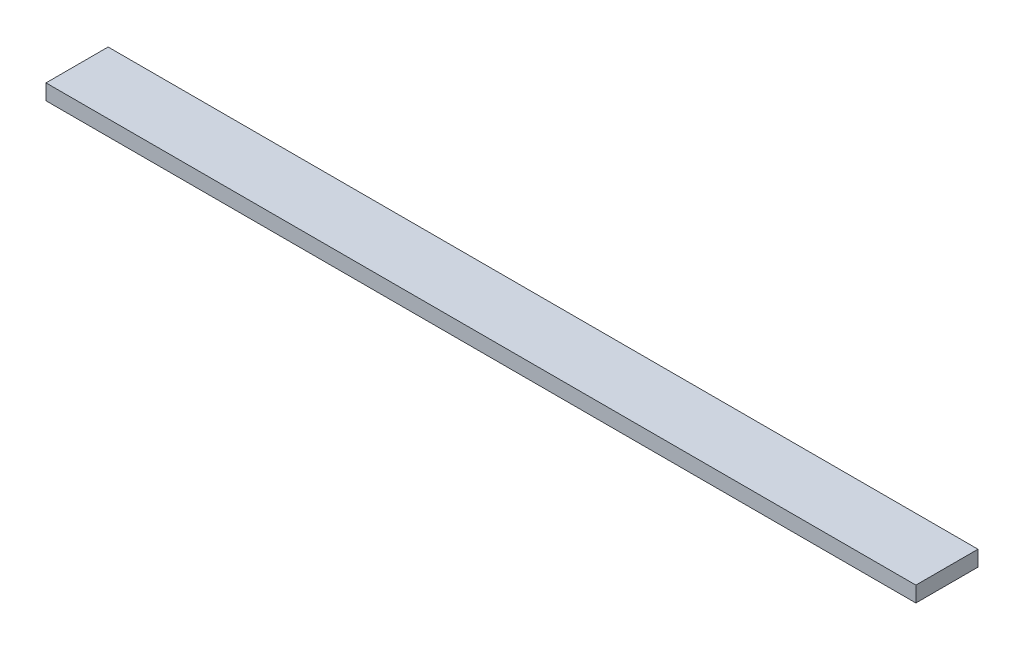
ISO-10303-21;
HEADER;
FILE_DESCRIPTION(('STEP AP214'),'2;1');
FILE_NAME('part.step','',(''),(''),'','','');
FILE_SCHEMA(('AUTOMOTIVE_DESIGN { 1 0 10303 214 1 1 1 1 }'));
ENDSEC;
DATA;
#1=APPLICATION_CONTEXT('core data for automotive mechanical design processes');
#2=APPLICATION_PROTOCOL_DEFINITION('international standard','automotive_design',2000,#1);
#3=PRODUCT_CONTEXT('',#1,'mechanical');
#4=PRODUCT('Part','Part','',(#3));
#5=PRODUCT_RELATED_PRODUCT_CATEGORY('part','',(#4));
#6=PRODUCT_DEFINITION_FORMATION('','',#4);
#7=PRODUCT_DEFINITION_CONTEXT('part definition',#1,'design');
#8=PRODUCT_DEFINITION('design','',#6,#7);
#9=PRODUCT_DEFINITION_SHAPE('','',#8);
#10=(LENGTH_UNIT() NAMED_UNIT(*) SI_UNIT(.MILLI.,.METRE.));
#11=(NAMED_UNIT(*) PLANE_ANGLE_UNIT() SI_UNIT($,.RADIAN.));
#12=(NAMED_UNIT(*) SI_UNIT($,.STERADIAN.) SOLID_ANGLE_UNIT());
#13=UNCERTAINTY_MEASURE_WITH_UNIT(LENGTH_MEASURE(1.E-05),#10,'distance_accuracy_value','');
#14=(GEOMETRIC_REPRESENTATION_CONTEXT(3) GLOBAL_UNCERTAINTY_ASSIGNED_CONTEXT((#13)) GLOBAL_UNIT_ASSIGNED_CONTEXT((#10,
#11,#12)) REPRESENTATION_CONTEXT('',''));
#15=CARTESIAN_POINT('',(0.,0.,0.));
#16=DIRECTION('',(0.,0.,1.));
#17=DIRECTION('',(1.,0.,0.));
#18=AXIS2_PLACEMENT_3D('',#15,#16,#17);
#19=CARTESIAN_POINT('',(0.,3.175,0.));
#20=DIRECTION('',(1.,0.,0.));
#21=DIRECTION('',(0.,0.,-1.));
#22=AXIS2_PLACEMENT_3D('',#19,#20,#21);
#23=PLANE('',#22);
#24=DIRECTION('',(0.,0.,1.));
#25=VECTOR('',#24,1.);
#26=CARTESIAN_POINT('',(0.,0.,0.));
#27=LINE('',#26,#25);
#28=CARTESIAN_POINT('',(0.,0.,-12.7));
#29=VERTEX_POINT('',#28);
#30=CARTESIAN_POINT('',(0.,0.,0.));
#31=VERTEX_POINT('',#30);
#32=EDGE_CURVE('E95',#29,#31,#27,.T.);
#33=ORIENTED_EDGE('',*,*,#32,.T.);
#34=DIRECTION('',(0.,-1.,0.));
#35=VECTOR('',#34,1.);
#36=CARTESIAN_POINT('',(0.,3.175,0.));
#37=LINE('',#36,#35);
#38=CARTESIAN_POINT('',(0.,3.175,0.));
#39=VERTEX_POINT('',#38);
#40=EDGE_CURVE('E11',#39,#31,#37,.T.);
#41=ORIENTED_EDGE('',*,*,#40,.F.);
#42=DIRECTION('',(0.,0.,1.));
#43=VECTOR('',#42,1.);
#44=CARTESIAN_POINT('',(0.,3.175,0.));
#45=LINE('',#44,#43);
#46=CARTESIAN_POINT('',(0.,3.175,-12.7));
#47=VERTEX_POINT('',#46);
#48=EDGE_CURVE('E83',#47,#39,#45,.T.);
#49=ORIENTED_EDGE('',*,*,#48,.F.);
#50=DIRECTION('',(0.,-1.,0.));
#51=VECTOR('',#50,1.);
#52=CARTESIAN_POINT('',(0.,3.175,-12.7));
#53=LINE('',#52,#51);
#54=EDGE_CURVE('E91',#47,#29,#53,.T.);
#55=ORIENTED_EDGE('',*,*,#54,.T.);
#56=EDGE_LOOP('',(#33,#41,#49,#55));
#57=FACE_BOUND('',#56,.T.);
#58=ADVANCED_FACE('F32',(#57),#23,.F.);
#59=CARTESIAN_POINT('',(0.,3.175,0.));
#60=DIRECTION('',(0.,0.,-1.));
#61=DIRECTION('',(-1.,0.,0.));
#62=AXIS2_PLACEMENT_3D('',#59,#60,#61);
#63=PLANE('',#62);
#64=DIRECTION('',(1.,0.,0.));
#65=VECTOR('',#64,1.);
#66=CARTESIAN_POINT('',(0.,0.,0.));
#67=LINE('',#66,#65);
#68=CARTESIAN_POINT('',(177.8,0.,0.));
#69=VERTEX_POINT('',#68);
#70=EDGE_CURVE('E87',#31,#69,#67,.T.);
#71=ORIENTED_EDGE('',*,*,#70,.T.);
#72=DIRECTION('',(0.,-1.,0.));
#73=VECTOR('',#72,1.);
#74=CARTESIAN_POINT('',(177.8,3.175,0.));
#75=LINE('',#74,#73);
#76=CARTESIAN_POINT('',(177.8,3.175,0.));
#77=VERTEX_POINT('',#76);
#78=EDGE_CURVE('E40',#77,#69,#75,.T.);
#79=ORIENTED_EDGE('',*,*,#78,.F.);
#80=DIRECTION('',(1.,0.,0.));
#81=VECTOR('',#80,1.);
#82=CARTESIAN_POINT('',(0.,3.175,0.));
#83=LINE('',#82,#81);
#84=EDGE_CURVE('E78',#39,#77,#83,.T.);
#85=ORIENTED_EDGE('',*,*,#84,.F.);
#86=ORIENTED_EDGE('',*,*,#40,.T.);
#87=EDGE_LOOP('',(#71,#79,#85,#86));
#88=FACE_BOUND('',#87,.T.);
#89=ADVANCED_FACE('F86',(#88),#63,.F.);
#90=CARTESIAN_POINT('',(177.8,3.175,0.));
#91=DIRECTION('',(-1.,0.,0.));
#92=DIRECTION('',(0.,0.,1.));
#93=AXIS2_PLACEMENT_3D('',#90,#91,#92);
#94=PLANE('',#93);
#95=DIRECTION('',(0.,0.,-1.));
#96=VECTOR('',#95,1.);
#97=CARTESIAN_POINT('',(177.8,0.,0.));
#98=LINE('',#97,#96);
#99=CARTESIAN_POINT('',(177.8,0.,-12.7));
#100=VERTEX_POINT('',#99);
#101=EDGE_CURVE('E65',#69,#100,#98,.T.);
#102=ORIENTED_EDGE('',*,*,#101,.T.);
#103=DIRECTION('',(0.,-1.,0.));
#104=VECTOR('',#103,1.);
#105=CARTESIAN_POINT('',(177.8,3.175,-12.7));
#106=LINE('',#105,#104);
#107=CARTESIAN_POINT('',(177.8,3.175,-12.7));
#108=VERTEX_POINT('',#107);
#109=EDGE_CURVE('E88',#108,#100,#106,.T.);
#110=ORIENTED_EDGE('',*,*,#109,.F.);
#111=DIRECTION('',(0.,0.,-1.));
#112=VECTOR('',#111,1.);
#113=CARTESIAN_POINT('',(177.8,3.175,0.));
#114=LINE('',#113,#112);
#115=EDGE_CURVE('E81',#77,#108,#114,.T.);
#116=ORIENTED_EDGE('',*,*,#115,.F.);
#117=ORIENTED_EDGE('',*,*,#78,.T.);
#118=EDGE_LOOP('',(#102,#110,#116,#117));
#119=FACE_BOUND('',#118,.T.);
#120=ADVANCED_FACE('F89',(#119),#94,.F.);
#121=CARTESIAN_POINT('',(0.,3.175,-12.7));
#122=DIRECTION('',(0.,0.,1.));
#123=DIRECTION('',(1.,0.,0.));
#124=AXIS2_PLACEMENT_3D('',#121,#122,#123);
#125=PLANE('',#124);
#126=DIRECTION('',(-1.,0.,0.));
#127=VECTOR('',#126,1.);
#128=CARTESIAN_POINT('',(0.,0.,-12.7));
#129=LINE('',#128,#127);
#130=EDGE_CURVE('E71',#100,#29,#129,.T.);
#131=ORIENTED_EDGE('',*,*,#130,.T.);
#132=ORIENTED_EDGE('',*,*,#54,.F.);
#133=DIRECTION('',(-1.,0.,0.));
#134=VECTOR('',#133,1.);
#135=CARTESIAN_POINT('',(0.,3.175,-12.7));
#136=LINE('',#135,#134);
#137=EDGE_CURVE('E48',#108,#47,#136,.T.);
#138=ORIENTED_EDGE('',*,*,#137,.F.);
#139=ORIENTED_EDGE('',*,*,#109,.T.);
#140=EDGE_LOOP('',(#131,#132,#138,#139));
#141=FACE_BOUND('',#140,.T.);
#142=ADVANCED_FACE('F102',(#141),#125,.F.);
#143=CARTESIAN_POINT('',(0.,3.175,0.));
#144=DIRECTION('',(0.,-1.,0.));
#145=DIRECTION('',(0.,0.,-1.));
#146=AXIS2_PLACEMENT_3D('',#143,#144,#145);
#147=PLANE('',#146);
#148=ORIENTED_EDGE('',*,*,#48,.T.);
#149=ORIENTED_EDGE('',*,*,#84,.T.);
#150=ORIENTED_EDGE('',*,*,#115,.T.);
#151=ORIENTED_EDGE('',*,*,#137,.T.);
#152=EDGE_LOOP('',(#148,#149,#150,#151));
#153=FACE_BOUND('',#152,.T.);
#154=ADVANCED_FACE('F79',(#153),#147,.F.);
#155=CARTESIAN_POINT('',(0.,0.,0.));
#156=DIRECTION('',(0.,-1.,0.));
#157=DIRECTION('',(0.,0.,-1.));
#158=AXIS2_PLACEMENT_3D('',#155,#156,#157);
#159=PLANE('',#158);
#160=ORIENTED_EDGE('',*,*,#32,.F.);
#161=ORIENTED_EDGE('',*,*,#130,.F.);
#162=ORIENTED_EDGE('',*,*,#101,.F.);
#163=ORIENTED_EDGE('',*,*,#70,.F.);
#164=EDGE_LOOP('',(#160,#161,#162,#163));
#165=FACE_BOUND('',#164,.T.);
#166=ADVANCED_FACE('F105',(#165),#159,.T.);
#167=CLOSED_SHELL('',(#58,#89,#120,#142,#154,#166));
#168=MANIFOLD_SOLID_BREP('B2',#167);
#169=ADVANCED_BREP_SHAPE_REPRESENTATION('',(#18,#168),#14);
#170=SHAPE_DEFINITION_REPRESENTATION(#9,#169);
ENDSEC;
END-ISO-10303-21;
